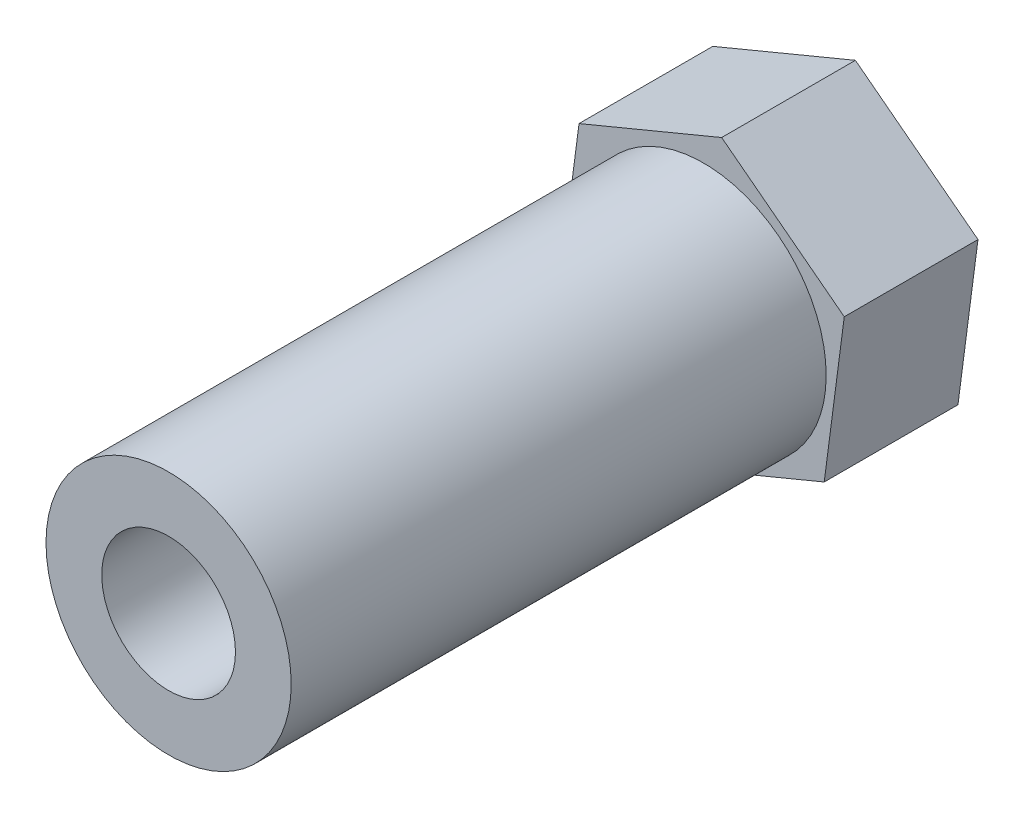
ISO-10303-21;
HEADER;
FILE_DESCRIPTION(('STEP AP214'),'2;1');
FILE_NAME('part.step','',(''),(''),'','','');
FILE_SCHEMA(('AUTOMOTIVE_DESIGN { 1 0 10303 214 1 1 1 1 }'));
ENDSEC;
DATA;
#1=APPLICATION_CONTEXT('core data for automotive mechanical design processes');
#2=APPLICATION_PROTOCOL_DEFINITION('international standard','automotive_design',2000,#1);
#3=PRODUCT_CONTEXT('',#1,'mechanical');
#4=PRODUCT('Part','Part','',(#3));
#5=PRODUCT_RELATED_PRODUCT_CATEGORY('part','',(#4));
#6=PRODUCT_DEFINITION_FORMATION('','',#4);
#7=PRODUCT_DEFINITION_CONTEXT('part definition',#1,'design');
#8=PRODUCT_DEFINITION('design','',#6,#7);
#9=PRODUCT_DEFINITION_SHAPE('','',#8);
#10=(LENGTH_UNIT() NAMED_UNIT(*) SI_UNIT(.MILLI.,.METRE.));
#11=(NAMED_UNIT(*) PLANE_ANGLE_UNIT() SI_UNIT($,.RADIAN.));
#12=(NAMED_UNIT(*) SI_UNIT($,.STERADIAN.) SOLID_ANGLE_UNIT());
#13=UNCERTAINTY_MEASURE_WITH_UNIT(LENGTH_MEASURE(1.E-05),#10,'distance_accuracy_value','');
#14=(GEOMETRIC_REPRESENTATION_CONTEXT(3) GLOBAL_UNCERTAINTY_ASSIGNED_CONTEXT((#13)) GLOBAL_UNIT_ASSIGNED_CONTEXT((#10,
#11,#12)) REPRESENTATION_CONTEXT('',''));
#15=CARTESIAN_POINT('',(0.,0.,0.));
#16=DIRECTION('',(0.,0.,1.));
#17=DIRECTION('',(1.,0.,0.));
#18=AXIS2_PLACEMENT_3D('',#15,#16,#17);
#19=CARTESIAN_POINT('',(-5.44836310830432,-4.91987947359598,6.));
#20=DIRECTION('',(-0.383407783690089,0.923579163583639,0.));
#21=DIRECTION('',(-0.923579163583639,-0.383407783690089,0.));
#22=AXIS2_PLACEMENT_3D('',#19,#20,#21);
#23=PLANE('',#22);
#24=DIRECTION('',(0.923579163583639,0.383407783690089,0.));
#25=VECTOR('',#24,1.);
#26=CARTESIAN_POINT('',(-5.44836310830432,-4.91987947359598,0.));
#27=LINE('',#26,#25);
#28=CARTESIAN_POINT('',(-5.44836310830432,-4.91987947359598,0.));
#29=VERTEX_POINT('',#28);
#30=CARTESIAN_POINT('',(0.950381036250998,-2.26355242812153,0.));
#31=VERTEX_POINT('',#30);
#32=EDGE_CURVE('E120',#29,#31,#27,.T.);
#33=ORIENTED_EDGE('',*,*,#32,.T.);
#34=DIRECTION('',(0.,0.,-1.));
#35=VECTOR('',#34,1.);
#36=CARTESIAN_POINT('',(0.950381036250998,-2.26355242812153,6.));
#37=LINE('',#36,#35);
#38=CARTESIAN_POINT('',(0.950381036250998,-2.26355242812153,6.));
#39=VERTEX_POINT('',#38);
#40=EDGE_CURVE('E37',#39,#31,#37,.T.);
#41=ORIENTED_EDGE('',*,*,#40,.F.);
#42=DIRECTION('',(0.923579163583639,0.383407783690089,0.));
#43=VECTOR('',#42,1.);
#44=CARTESIAN_POINT('',(-5.44836310830432,-4.91987947359598,6.));
#45=LINE('',#44,#43);
#46=CARTESIAN_POINT('',(-5.44836310830432,-4.91987947359598,6.));
#47=VERTEX_POINT('',#46);
#48=EDGE_CURVE('E131',#47,#39,#45,.T.);
#49=ORIENTED_EDGE('',*,*,#48,.F.);
#50=DIRECTION('',(0.,0.,-1.));
#51=VECTOR('',#50,1.);
#52=CARTESIAN_POINT('',(-5.44836310830432,-4.91987947359598,6.));
#53=LINE('',#52,#51);
#54=EDGE_CURVE('E116',#47,#29,#53,.T.);
#55=ORIENTED_EDGE('',*,*,#54,.T.);
#56=EDGE_LOOP('',(#33,#41,#49,#55));
#57=FACE_BOUND('',#56,.T.);
#58=ADVANCED_FACE('F34',(#57),#23,.F.);
#59=CARTESIAN_POINT('',(0.950381036250998,-2.26355242812153,6.));
#60=DIRECTION('',(-0.991546909914459,0.129748701107513,0.));
#61=DIRECTION('',(-0.129748701107513,-0.99154690991446,0.));
#62=AXIS2_PLACEMENT_3D('',#59,#60,#61);
#63=PLANE('',#62);
#64=DIRECTION('',(0.129748701107513,0.991546909914459,0.));
#65=VECTOR('',#64,1.);
#66=CARTESIAN_POINT('',(0.950381036250998,-2.26355242812153,0.));
#67=LINE('',#66,#65);
#68=CARTESIAN_POINT('',(1.84930640638812,4.60608607611753,0.));
#69=VERTEX_POINT('',#68);
#70=EDGE_CURVE('E123',#31,#69,#67,.T.);
#71=ORIENTED_EDGE('',*,*,#70,.T.);
#72=DIRECTION('',(0.,0.,-1.));
#73=VECTOR('',#72,1.);
#74=CARTESIAN_POINT('',(1.84930640638812,4.60608607611753,6.));
#75=LINE('',#74,#73);
#76=CARTESIAN_POINT('',(1.84930640638812,4.60608607611753,6.));
#77=VERTEX_POINT('',#76);
#78=EDGE_CURVE('E134',#77,#69,#75,.T.);
#79=ORIENTED_EDGE('',*,*,#78,.F.);
#80=DIRECTION('',(0.129748701107513,0.991546909914459,0.));
#81=VECTOR('',#80,1.);
#82=CARTESIAN_POINT('',(0.950381036250998,-2.26355242812153,6.));
#83=LINE('',#82,#81);
#84=EDGE_CURVE('E89',#39,#77,#83,.T.);
#85=ORIENTED_EDGE('',*,*,#84,.F.);
#86=ORIENTED_EDGE('',*,*,#40,.T.);
#87=EDGE_LOOP('',(#71,#79,#85,#86));
#88=FACE_BOUND('',#87,.T.);
#89=ADVANCED_FACE('F139',(#88),#63,.F.);
#90=CARTESIAN_POINT('',(1.84930640638812,4.60608607611753,6.));
#91=DIRECTION('',(-0.608139126224371,-0.793830462476125,0.));
#92=DIRECTION('',(0.793830462476125,-0.608139126224371,0.));
#93=AXIS2_PLACEMENT_3D('',#90,#91,#92);
#94=PLANE('',#93);
#95=DIRECTION('',(-0.793830462476125,0.608139126224371,0.));
#96=VECTOR('',#95,1.);
#97=CARTESIAN_POINT('',(1.84930640638812,4.60608607611753,0.));
#98=LINE('',#97,#96);
#99=CARTESIAN_POINT('',(-3.65051236803007,8.81939753488214,0.));
#100=VERTEX_POINT('',#99);
#101=EDGE_CURVE('E126',#69,#100,#98,.T.);
#102=ORIENTED_EDGE('',*,*,#101,.T.);
#103=DIRECTION('',(0.,0.,-1.));
#104=VECTOR('',#103,1.);
#105=CARTESIAN_POINT('',(-3.65051236803007,8.81939753488214,6.));
#106=LINE('',#105,#104);
#107=CARTESIAN_POINT('',(-3.65051236803007,8.81939753488214,6.));
#108=VERTEX_POINT('',#107);
#109=EDGE_CURVE('E111',#108,#100,#106,.T.);
#110=ORIENTED_EDGE('',*,*,#109,.F.);
#111=DIRECTION('',(-0.793830462476125,0.608139126224371,0.));
#112=VECTOR('',#111,1.);
#113=CARTESIAN_POINT('',(1.84930640638812,4.60608607611753,6.));
#114=LINE('',#113,#112);
#115=EDGE_CURVE('E102',#77,#108,#114,.T.);
#116=ORIENTED_EDGE('',*,*,#115,.F.);
#117=ORIENTED_EDGE('',*,*,#78,.T.);
#118=EDGE_LOOP('',(#102,#110,#116,#117));
#119=FACE_BOUND('',#118,.T.);
#120=ADVANCED_FACE('F145',(#119),#94,.F.);
#121=CARTESIAN_POINT('',(-3.65051236803007,8.81939753488214,6.));
#122=DIRECTION('',(0.383407783690089,-0.923579163583639,0.));
#123=DIRECTION('',(0.923579163583639,0.383407783690089,0.));
#124=AXIS2_PLACEMENT_3D('',#121,#122,#123);
#125=PLANE('',#124);
#126=DIRECTION('',(-0.923579163583639,-0.383407783690089,0.));
#127=VECTOR('',#126,1.);
#128=CARTESIAN_POINT('',(-3.65051236803007,8.81939753488214,0.));
#129=LINE('',#128,#127);
#130=CARTESIAN_POINT('',(-10.0492565125854,6.16307048940769,0.));
#131=VERTEX_POINT('',#130);
#132=EDGE_CURVE('E110',#100,#131,#129,.T.);
#133=ORIENTED_EDGE('',*,*,#132,.T.);
#134=DIRECTION('',(0.,0.,-1.));
#135=VECTOR('',#134,1.);
#136=CARTESIAN_POINT('',(-10.0492565125854,6.16307048940769,6.));
#137=LINE('',#136,#135);
#138=CARTESIAN_POINT('',(-10.0492565125854,6.16307048940769,6.));
#139=VERTEX_POINT('',#138);
#140=EDGE_CURVE('E107',#139,#131,#137,.T.);
#141=ORIENTED_EDGE('',*,*,#140,.F.);
#142=DIRECTION('',(-0.923579163583639,-0.383407783690089,0.));
#143=VECTOR('',#142,1.);
#144=CARTESIAN_POINT('',(-3.65051236803007,8.81939753488214,6.));
#145=LINE('',#144,#143);
#146=EDGE_CURVE('E96',#108,#139,#145,.T.);
#147=ORIENTED_EDGE('',*,*,#146,.F.);
#148=ORIENTED_EDGE('',*,*,#109,.T.);
#149=EDGE_LOOP('',(#133,#141,#147,#148));
#150=FACE_BOUND('',#149,.T.);
#151=ADVANCED_FACE('F108',(#150),#125,.F.);
#152=CARTESIAN_POINT('',(-10.0492565125854,6.16307048940769,6.));
#153=DIRECTION('',(0.991546909914459,-0.129748701107513,0.));
#154=DIRECTION('',(0.129748701107513,0.99154690991446,0.));
#155=AXIS2_PLACEMENT_3D('',#152,#153,#154);
#156=PLANE('',#155);
#157=DIRECTION('',(-0.129748701107513,-0.991546909914459,0.));
#158=VECTOR('',#157,1.);
#159=CARTESIAN_POINT('',(-10.0492565125854,6.16307048940769,0.));
#160=LINE('',#159,#158);
#161=CARTESIAN_POINT('',(-10.9481818827225,-0.706568014831371,0.));
#162=VERTEX_POINT('',#161);
#163=EDGE_CURVE('E74',#131,#162,#160,.T.);
#164=ORIENTED_EDGE('',*,*,#163,.T.);
#165=DIRECTION('',(0.,0.,-1.));
#166=VECTOR('',#165,1.);
#167=CARTESIAN_POINT('',(-10.9481818827225,-0.706568014831371,6.));
#168=LINE('',#167,#166);
#169=CARTESIAN_POINT('',(-10.9481818827225,-0.706568014831371,6.));
#170=VERTEX_POINT('',#169);
#171=EDGE_CURVE('E112',#170,#162,#168,.T.);
#172=ORIENTED_EDGE('',*,*,#171,.F.);
#173=DIRECTION('',(-0.129748701107513,-0.991546909914459,0.));
#174=VECTOR('',#173,1.);
#175=CARTESIAN_POINT('',(-10.0492565125854,6.16307048940769,6.));
#176=LINE('',#175,#174);
#177=EDGE_CURVE('E100',#139,#170,#176,.T.);
#178=ORIENTED_EDGE('',*,*,#177,.F.);
#179=ORIENTED_EDGE('',*,*,#140,.T.);
#180=EDGE_LOOP('',(#164,#172,#178,#179));
#181=FACE_BOUND('',#180,.T.);
#182=ADVANCED_FACE('F114',(#181),#156,.F.);
#183=CARTESIAN_POINT('',(-10.9481818827225,-0.706568014831371,6.));
#184=DIRECTION('',(0.60813912622437,0.793830462476125,0.));
#185=DIRECTION('',(-0.793830462476126,0.608139126224371,0.));
#186=AXIS2_PLACEMENT_3D('',#183,#184,#185);
#187=PLANE('',#186);
#188=DIRECTION('',(0.793830462476126,-0.608139126224371,0.));
#189=VECTOR('',#188,1.);
#190=CARTESIAN_POINT('',(-10.9481818827225,-0.706568014831371,0.));
#191=LINE('',#190,#189);
#192=EDGE_CURVE('E80',#162,#29,#191,.T.);
#193=ORIENTED_EDGE('',*,*,#192,.T.);
#194=ORIENTED_EDGE('',*,*,#54,.F.);
#195=DIRECTION('',(0.793830462476126,-0.608139126224371,0.));
#196=VECTOR('',#195,1.);
#197=CARTESIAN_POINT('',(-10.9481818827225,-0.706568014831371,6.));
#198=LINE('',#197,#196);
#199=EDGE_CURVE('E51',#170,#47,#198,.T.);
#200=ORIENTED_EDGE('',*,*,#199,.F.);
#201=ORIENTED_EDGE('',*,*,#171,.T.);
#202=EDGE_LOOP('',(#193,#194,#200,#201));
#203=FACE_BOUND('',#202,.T.);
#204=ADVANCED_FACE('F187',(#203),#187,.F.);
#205=CARTESIAN_POINT('',(0.,0.,6.));
#206=DIRECTION('',(0.,0.,1.));
#207=DIRECTION('',(1.,0.,0.));
#208=AXIS2_PLACEMENT_3D('',#205,#206,#207);
#209=PLANE('',#208);
#210=CARTESIAN_POINT('',(-4.46207720452918,1.92531590853662,6.));
#211=DIRECTION('',(0.,0.,1.));
#212=DIRECTION('',(1.,0.,0.));
#213=AXIS2_PLACEMENT_3D('',#210,#211,#212);
#214=CIRCLE('',#213,5.5);
#215=CARTESIAN_POINT('',(1.03792279547082,1.92531590853662,6.));
#216=VERTEX_POINT('',#215);
#217=EDGE_CURVE('E11',#216,#216,#214,.T.);
#218=ORIENTED_EDGE('',*,*,#217,.F.);
#219=EDGE_LOOP('',(#218));
#220=FACE_BOUND('',#219,.T.);
#221=ORIENTED_EDGE('',*,*,#48,.T.);
#222=ORIENTED_EDGE('',*,*,#84,.T.);
#223=ORIENTED_EDGE('',*,*,#115,.T.);
#224=ORIENTED_EDGE('',*,*,#146,.T.);
#225=ORIENTED_EDGE('',*,*,#177,.T.);
#226=ORIENTED_EDGE('',*,*,#199,.T.);
#227=EDGE_LOOP('',(#221,#222,#223,#224,#225,#226));
#228=FACE_BOUND('',#227,.T.);
#229=ADVANCED_FACE('F98',(#220,#228),#209,.T.);
#230=CARTESIAN_POINT('',(0.,0.,0.));
#231=DIRECTION('',(0.,0.,1.));
#232=DIRECTION('',(1.,0.,0.));
#233=AXIS2_PLACEMENT_3D('',#230,#231,#232);
#234=PLANE('',#233);
#235=CARTESIAN_POINT('',(-4.46207720452918,1.92531590853662,0.));
#236=DIRECTION('',(0.,0.,-1.));
#237=DIRECTION('',(-1.,0.,0.));
#238=AXIS2_PLACEMENT_3D('',#235,#236,#237);
#239=CIRCLE('',#238,1.5);
#240=CARTESIAN_POINT('',(-5.96207720452918,1.92531590853662,0.));
#241=VERTEX_POINT('',#240);
#242=EDGE_CURVE('E151',#241,#241,#239,.T.);
#243=ORIENTED_EDGE('',*,*,#242,.F.);
#244=EDGE_LOOP('',(#243));
#245=FACE_BOUND('',#244,.T.);
#246=ORIENTED_EDGE('',*,*,#32,.F.);
#247=ORIENTED_EDGE('',*,*,#192,.F.);
#248=ORIENTED_EDGE('',*,*,#163,.F.);
#249=ORIENTED_EDGE('',*,*,#132,.F.);
#250=ORIENTED_EDGE('',*,*,#101,.F.);
#251=ORIENTED_EDGE('',*,*,#70,.F.);
#252=EDGE_LOOP('',(#246,#247,#248,#249,#250,#251));
#253=FACE_BOUND('',#252,.T.);
#254=ADVANCED_FACE('F144',(#245,#253),#234,.F.);
#255=CARTESIAN_POINT('',(-4.46207720452918,1.92531590853662,30.));
#256=DIRECTION('',(0.,0.,-1.));
#257=DIRECTION('',(-1.,0.,0.));
#258=AXIS2_PLACEMENT_3D('',#255,#256,#257);
#259=CYLINDRICAL_SURFACE('',#258,5.5);
#260=CARTESIAN_POINT('',(-4.46207720452918,1.92531590853662,30.));
#261=DIRECTION('',(0.,0.,1.));
#262=DIRECTION('',(1.,0.,0.));
#263=AXIS2_PLACEMENT_3D('',#260,#261,#262);
#264=CIRCLE('',#263,5.5);
#265=CARTESIAN_POINT('',(1.03792279547082,1.92531590853662,30.));
#266=VERTEX_POINT('',#265);
#267=EDGE_CURVE('E124',#266,#266,#264,.T.);
#268=ORIENTED_EDGE('',*,*,#267,.F.);
#269=EDGE_LOOP('',(#268));
#270=FACE_BOUND('',#269,.T.);
#271=ORIENTED_EDGE('',*,*,#217,.T.);
#272=EDGE_LOOP('',(#271));
#273=FACE_BOUND('',#272,.T.);
#274=ADVANCED_FACE('F177',(#270,#273),#259,.T.);
#275=CARTESIAN_POINT('',(-4.46207720452918,1.92531590853662,30.));
#276=DIRECTION('',(0.,0.,1.));
#277=DIRECTION('',(1.,0.,0.));
#278=AXIS2_PLACEMENT_3D('',#275,#276,#277);
#279=PLANE('',#278);
#280=CARTESIAN_POINT('',(-4.46207720452918,1.92531590853662,30.));
#281=DIRECTION('',(0.,0.,1.));
#282=DIRECTION('',(1.,0.,0.));
#283=AXIS2_PLACEMENT_3D('',#280,#281,#282);
#284=CIRCLE('',#283,3.);
#285=CARTESIAN_POINT('',(-1.46207720452918,1.92531590853662,30.));
#286=VERTEX_POINT('',#285);
#287=EDGE_CURVE('E158',#286,#286,#284,.T.);
#288=ORIENTED_EDGE('',*,*,#287,.F.);
#289=EDGE_LOOP('',(#288));
#290=FACE_BOUND('',#289,.T.);
#291=ORIENTED_EDGE('',*,*,#267,.T.);
#292=EDGE_LOOP('',(#291));
#293=FACE_BOUND('',#292,.T.);
#294=ADVANCED_FACE('F173',(#290,#293),#279,.T.);
#295=CARTESIAN_POINT('',(-4.46207720452918,1.92531590853662,6.));
#296=DIRECTION('',(0.,0.,-1.));
#297=DIRECTION('',(-1.,0.,0.));
#298=AXIS2_PLACEMENT_3D('',#295,#296,#297);
#299=CYLINDRICAL_SURFACE('',#298,1.5);
#300=CARTESIAN_POINT('',(-4.46207720452918,1.92531590853662,6.));
#301=DIRECTION('',(0.,0.,-1.));
#302=DIRECTION('',(-1.,0.,0.));
#303=AXIS2_PLACEMENT_3D('',#300,#301,#302);
#304=CIRCLE('',#303,1.5);
#305=CARTESIAN_POINT('',(-5.96207720452918,1.92531590853662,6.));
#306=VERTEX_POINT('',#305);
#307=EDGE_CURVE('E154',#306,#306,#304,.T.);
#308=ORIENTED_EDGE('',*,*,#307,.F.);
#309=EDGE_LOOP('',(#308));
#310=FACE_BOUND('',#309,.T.);
#311=ORIENTED_EDGE('',*,*,#242,.T.);
#312=EDGE_LOOP('',(#311));
#313=FACE_BOUND('',#312,.T.);
#314=ADVANCED_FACE('F176',(#310,#313),#299,.F.);
#315=CARTESIAN_POINT('',(-4.46207720452918,1.92531590853662,6.));
#316=DIRECTION('',(0.,0.,1.));
#317=DIRECTION('',(1.,0.,0.));
#318=AXIS2_PLACEMENT_3D('',#315,#316,#317);
#319=PLANE('',#318);
#320=CARTESIAN_POINT('',(-4.46207720452918,1.92531590853662,6.));
#321=DIRECTION('',(0.,0.,1.));
#322=DIRECTION('',(1.,0.,0.));
#323=AXIS2_PLACEMENT_3D('',#320,#321,#322);
#324=CIRCLE('',#323,3.);
#325=CARTESIAN_POINT('',(-1.46207720452918,1.92531590853662,6.));
#326=VERTEX_POINT('',#325);
#327=EDGE_CURVE('E157',#326,#326,#324,.T.);
#328=ORIENTED_EDGE('',*,*,#327,.T.);
#329=EDGE_LOOP('',(#328));
#330=FACE_BOUND('',#329,.T.);
#331=ORIENTED_EDGE('',*,*,#307,.T.);
#332=EDGE_LOOP('',(#331));
#333=FACE_BOUND('',#332,.T.);
#334=ADVANCED_FACE('F164',(#330,#333),#319,.T.);
#335=CARTESIAN_POINT('',(-4.46207720452918,1.92531590853662,6.));
#336=DIRECTION('',(0.,0.,1.));
#337=DIRECTION('',(1.,0.,0.));
#338=AXIS2_PLACEMENT_3D('',#335,#336,#337);
#339=CYLINDRICAL_SURFACE('',#338,3.);
#340=ORIENTED_EDGE('',*,*,#327,.F.);
#341=EDGE_LOOP('',(#340));
#342=FACE_BOUND('',#341,.T.);
#343=ORIENTED_EDGE('',*,*,#287,.T.);
#344=EDGE_LOOP('',(#343));
#345=FACE_BOUND('',#344,.T.);
#346=ADVANCED_FACE('F167',(#342,#345),#339,.F.);
#347=CLOSED_SHELL('',(#58,#89,#120,#151,#182,#204,#229,#254,#274,#294,#314,#334,#346));
#348=MANIFOLD_SOLID_BREP('B2',#347);
#349=ADVANCED_BREP_SHAPE_REPRESENTATION('',(#18,#348),#14);
#350=SHAPE_DEFINITION_REPRESENTATION(#9,#349);
ENDSEC;
END-ISO-10303-21;
